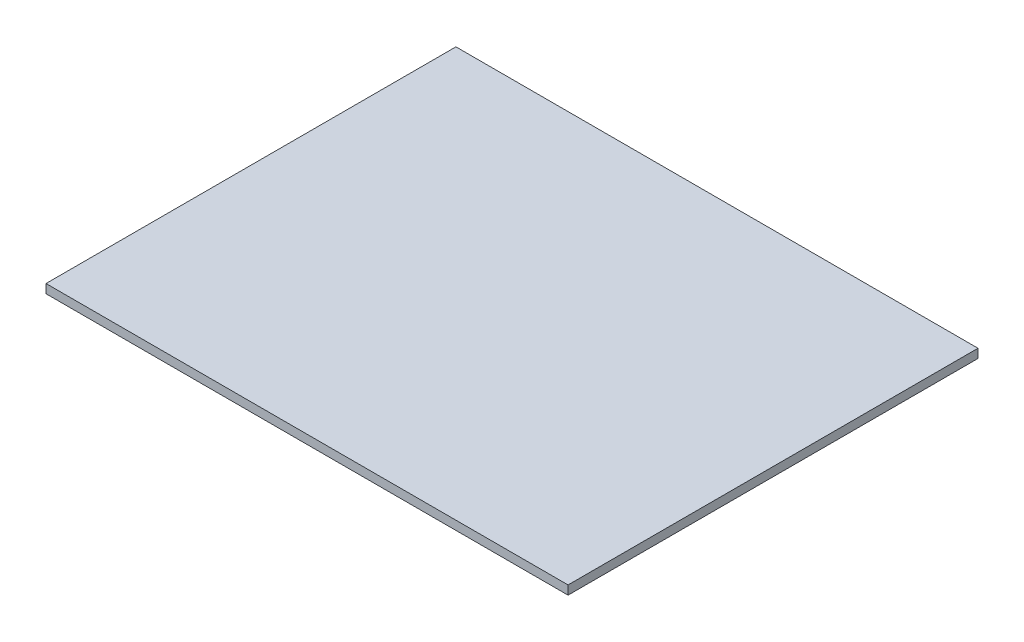
ISO-10303-21;
HEADER;
FILE_DESCRIPTION(('STEP AP214'),'2;1');
FILE_NAME('part.step','',(''),(''),'','','');
FILE_SCHEMA(('AUTOMOTIVE_DESIGN { 1 0 10303 214 1 1 1 1 }'));
ENDSEC;
DATA;
#1=APPLICATION_CONTEXT('core data for automotive mechanical design processes');
#2=APPLICATION_PROTOCOL_DEFINITION('international standard','automotive_design',2000,#1);
#3=PRODUCT_CONTEXT('',#1,'mechanical');
#4=PRODUCT('Part','Part','',(#3));
#5=PRODUCT_RELATED_PRODUCT_CATEGORY('part','',(#4));
#6=PRODUCT_DEFINITION_FORMATION('','',#4);
#7=PRODUCT_DEFINITION_CONTEXT('part definition',#1,'design');
#8=PRODUCT_DEFINITION('design','',#6,#7);
#9=PRODUCT_DEFINITION_SHAPE('','',#8);
#10=(LENGTH_UNIT() NAMED_UNIT(*) SI_UNIT(.MILLI.,.METRE.));
#11=(NAMED_UNIT(*) PLANE_ANGLE_UNIT() SI_UNIT($,.RADIAN.));
#12=(NAMED_UNIT(*) SI_UNIT($,.STERADIAN.) SOLID_ANGLE_UNIT());
#13=UNCERTAINTY_MEASURE_WITH_UNIT(LENGTH_MEASURE(1.E-05),#10,'distance_accuracy_value','');
#14=(GEOMETRIC_REPRESENTATION_CONTEXT(3) GLOBAL_UNCERTAINTY_ASSIGNED_CONTEXT((#13)) GLOBAL_UNIT_ASSIGNED_CONTEXT((#10,
#11,#12)) REPRESENTATION_CONTEXT('',''));
#15=CARTESIAN_POINT('',(0.,0.,0.));
#16=DIRECTION('',(0.,0.,1.));
#17=DIRECTION('',(1.,0.,0.));
#18=AXIS2_PLACEMENT_3D('',#15,#16,#17);
#19=CARTESIAN_POINT('',(766.536301612524,276.386749239304,1069.20385266952));
#20=DIRECTION('',(0.,0.,1.));
#21=DIRECTION('',(1.,0.,0.));
#22=AXIS2_PLACEMENT_3D('',#19,#20,#21);
#23=PLANE('',#22);
#24=DIRECTION('',(-1.,0.,0.));
#25=VECTOR('',#24,1.);
#26=CARTESIAN_POINT('',(766.536301612524,263.686749239304,1069.20385266952));
#27=LINE('',#26,#25);
#28=CARTESIAN_POINT('',(766.536301612524,263.686749239304,1069.20385266952));
#29=VERTEX_POINT('',#28);
#30=CARTESIAN_POINT('',(19.2937016125233,263.686749239312,1069.20385266952));
#31=VERTEX_POINT('',#30);
#32=EDGE_CURVE('E97',#29,#31,#27,.T.);
#33=ORIENTED_EDGE('',*,*,#32,.F.);
#34=DIRECTION('',(0.,-1.,0.));
#35=VECTOR('',#34,1.);
#36=CARTESIAN_POINT('',(766.536301612524,276.386749239304,1069.20385266952));
#37=LINE('',#36,#35);
#38=CARTESIAN_POINT('',(766.536301612524,276.386749239304,1069.20385266952));
#39=VERTEX_POINT('',#38);
#40=EDGE_CURVE('E11',#39,#29,#37,.T.);
#41=ORIENTED_EDGE('',*,*,#40,.F.);
#42=DIRECTION('',(-1.,0.,0.));
#43=VECTOR('',#42,1.);
#44=CARTESIAN_POINT('',(766.536301612524,276.386749239304,1069.20385266952));
#45=LINE('',#44,#43);
#46=CARTESIAN_POINT('',(19.2937016125234,276.386749239312,1069.20385266952));
#47=VERTEX_POINT('',#46);
#48=EDGE_CURVE('E91',#39,#47,#45,.T.);
#49=ORIENTED_EDGE('',*,*,#48,.T.);
#50=DIRECTION('',(0.,-1.,0.));
#51=VECTOR('',#50,1.);
#52=CARTESIAN_POINT('',(19.2937016125234,276.386749239312,1069.20385266952));
#53=LINE('',#52,#51);
#54=EDGE_CURVE('E36',#47,#31,#53,.T.);
#55=ORIENTED_EDGE('',*,*,#54,.T.);
#56=EDGE_LOOP('',(#33,#41,#49,#55));
#57=FACE_BOUND('',#56,.T.);
#58=ADVANCED_FACE('F33',(#57),#23,.T.);
#59=CARTESIAN_POINT('',(766.536301612524,276.386749239304,482.463852669516));
#60=DIRECTION('',(1.,0.,0.));
#61=DIRECTION('',(0.,1.,0.));
#62=AXIS2_PLACEMENT_3D('',#59,#60,#61);
#63=PLANE('',#62);
#64=DIRECTION('',(0.,0.,1.));
#65=VECTOR('',#64,1.);
#66=CARTESIAN_POINT('',(766.536301612524,263.686749239304,482.463852669516));
#67=LINE('',#66,#65);
#68=CARTESIAN_POINT('',(766.536301612524,263.686749239304,482.463852669516));
#69=VERTEX_POINT('',#68);
#70=EDGE_CURVE('E93',#69,#29,#67,.T.);
#71=ORIENTED_EDGE('',*,*,#70,.F.);
#72=DIRECTION('',(0.,-1.,0.));
#73=VECTOR('',#72,1.);
#74=CARTESIAN_POINT('',(766.536301612524,276.386749239304,482.463852669516));
#75=LINE('',#74,#73);
#76=CARTESIAN_POINT('',(766.536301612524,276.386749239304,482.463852669516));
#77=VERTEX_POINT('',#76);
#78=EDGE_CURVE('E42',#77,#69,#75,.T.);
#79=ORIENTED_EDGE('',*,*,#78,.F.);
#80=DIRECTION('',(0.,0.,1.));
#81=VECTOR('',#80,1.);
#82=CARTESIAN_POINT('',(766.536301612524,276.386749239304,482.463852669516));
#83=LINE('',#82,#81);
#84=EDGE_CURVE('E88',#77,#39,#83,.T.);
#85=ORIENTED_EDGE('',*,*,#84,.T.);
#86=ORIENTED_EDGE('',*,*,#40,.T.);
#87=EDGE_LOOP('',(#71,#79,#85,#86));
#88=FACE_BOUND('',#87,.T.);
#89=ADVANCED_FACE('F107',(#88),#63,.T.);
#90=CARTESIAN_POINT('',(19.2937016125234,276.386749239312,482.463852669517));
#91=DIRECTION('',(0.,0.,-1.));
#92=DIRECTION('',(-1.,0.,0.));
#93=AXIS2_PLACEMENT_3D('',#90,#91,#92);
#94=PLANE('',#93);
#95=DIRECTION('',(1.,0.,0.));
#96=VECTOR('',#95,1.);
#97=CARTESIAN_POINT('',(19.2937016125233,263.686749239312,482.463852669517));
#98=LINE('',#97,#96);
#99=CARTESIAN_POINT('',(19.2937016125233,263.686749239312,482.463852669517));
#100=VERTEX_POINT('',#99);
#101=EDGE_CURVE('E83',#100,#69,#98,.T.);
#102=ORIENTED_EDGE('',*,*,#101,.F.);
#103=DIRECTION('',(0.,-1.,0.));
#104=VECTOR('',#103,1.);
#105=CARTESIAN_POINT('',(19.2937016125234,276.386749239312,482.463852669517));
#106=LINE('',#105,#104);
#107=CARTESIAN_POINT('',(19.2937016125234,276.386749239312,482.463852669517));
#108=VERTEX_POINT('',#107);
#109=EDGE_CURVE('E78',#108,#100,#106,.T.);
#110=ORIENTED_EDGE('',*,*,#109,.F.);
#111=DIRECTION('',(1.,0.,0.));
#112=VECTOR('',#111,1.);
#113=CARTESIAN_POINT('',(19.2937016125234,276.386749239312,482.463852669517));
#114=LINE('',#113,#112);
#115=EDGE_CURVE('E81',#108,#77,#114,.T.);
#116=ORIENTED_EDGE('',*,*,#115,.T.);
#117=ORIENTED_EDGE('',*,*,#78,.T.);
#118=EDGE_LOOP('',(#102,#110,#116,#117));
#119=FACE_BOUND('',#118,.T.);
#120=ADVANCED_FACE('F80',(#119),#94,.T.);
#121=CARTESIAN_POINT('',(19.2937016125234,276.386749239312,1069.20385266952));
#122=DIRECTION('',(-1.,0.,0.));
#123=DIRECTION('',(0.,-1.,0.));
#124=AXIS2_PLACEMENT_3D('',#121,#122,#123);
#125=PLANE('',#124);
#126=DIRECTION('',(0.,0.,-1.));
#127=VECTOR('',#126,1.);
#128=CARTESIAN_POINT('',(19.2937016125233,263.686749239312,1069.20385266952));
#129=LINE('',#128,#127);
#130=EDGE_CURVE('E100',#31,#100,#129,.T.);
#131=ORIENTED_EDGE('',*,*,#130,.F.);
#132=ORIENTED_EDGE('',*,*,#54,.F.);
#133=DIRECTION('',(0.,0.,-1.));
#134=VECTOR('',#133,1.);
#135=CARTESIAN_POINT('',(19.2937016125234,276.386749239312,1069.20385266952));
#136=LINE('',#135,#134);
#137=EDGE_CURVE('E87',#47,#108,#136,.T.);
#138=ORIENTED_EDGE('',*,*,#137,.T.);
#139=ORIENTED_EDGE('',*,*,#109,.T.);
#140=EDGE_LOOP('',(#131,#132,#138,#139));
#141=FACE_BOUND('',#140,.T.);
#142=ADVANCED_FACE('F90',(#141),#125,.T.);
#143=CARTESIAN_POINT('',(2.87496464885154E-12,276.386749239312,0.));
#144=DIRECTION('',(0.,-1.,0.));
#145=DIRECTION('',(1.,0.,0.));
#146=AXIS2_PLACEMENT_3D('',#143,#144,#145);
#147=PLANE('',#146);
#148=ORIENTED_EDGE('',*,*,#48,.F.);
#149=ORIENTED_EDGE('',*,*,#84,.F.);
#150=ORIENTED_EDGE('',*,*,#115,.F.);
#151=ORIENTED_EDGE('',*,*,#137,.F.);
#152=EDGE_LOOP('',(#148,#149,#150,#151));
#153=FACE_BOUND('',#152,.T.);
#154=ADVANCED_FACE('F86',(#153),#147,.F.);
#155=CARTESIAN_POINT('',(2.74242622417179E-12,263.686749239312,0.));
#156=DIRECTION('',(0.,-1.,0.));
#157=DIRECTION('',(1.,0.,0.));
#158=AXIS2_PLACEMENT_3D('',#155,#156,#157);
#159=PLANE('',#158);
#160=ORIENTED_EDGE('',*,*,#32,.T.);
#161=ORIENTED_EDGE('',*,*,#130,.T.);
#162=ORIENTED_EDGE('',*,*,#101,.T.);
#163=ORIENTED_EDGE('',*,*,#70,.T.);
#164=EDGE_LOOP('',(#160,#161,#162,#163));
#165=FACE_BOUND('',#164,.T.);
#166=ADVANCED_FACE('F106',(#165),#159,.T.);
#167=CLOSED_SHELL('',(#58,#89,#120,#142,#154,#166));
#168=MANIFOLD_SOLID_BREP('B2',#167);
#169=ADVANCED_BREP_SHAPE_REPRESENTATION('',(#18,#168),#14);
#170=SHAPE_DEFINITION_REPRESENTATION(#9,#169);
ENDSEC;
END-ISO-10303-21;
